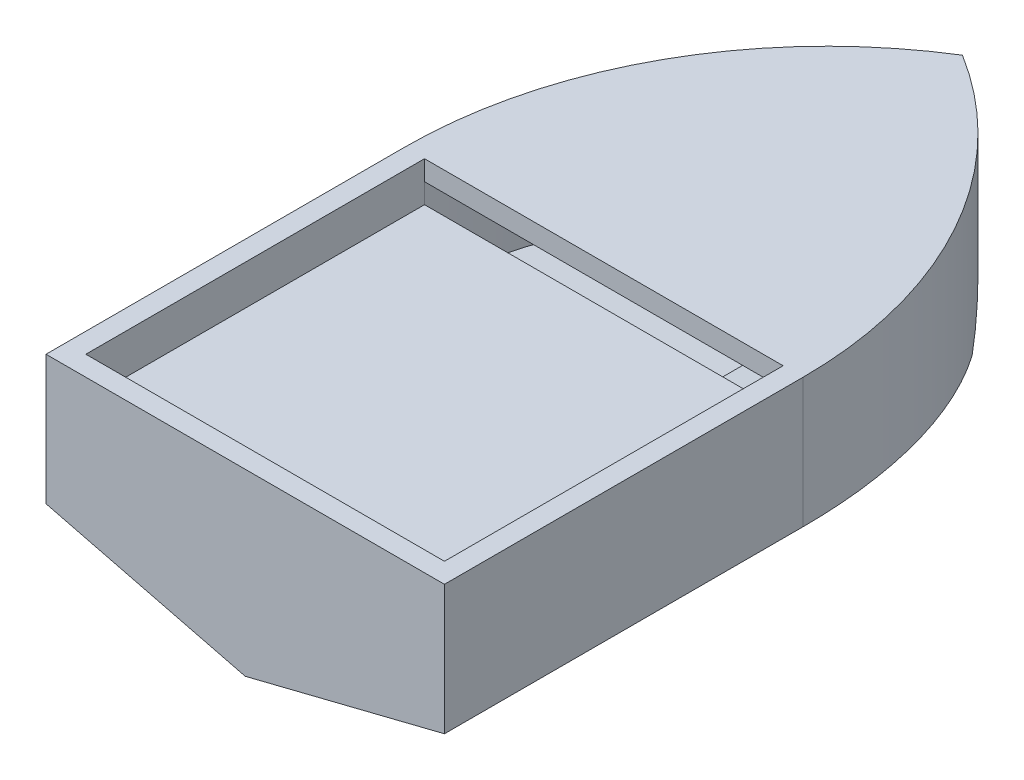
ISO-10303-21;
HEADER;
FILE_DESCRIPTION(('STEP AP214'),'2;1');
FILE_NAME('part.step','',(''),(''),'','','');
FILE_SCHEMA(('AUTOMOTIVE_DESIGN { 1 0 10303 214 1 1 1 1 }'));
ENDSEC;
DATA;
#1=APPLICATION_CONTEXT('core data for automotive mechanical design processes');
#2=APPLICATION_PROTOCOL_DEFINITION('international standard','automotive_design',2000,#1);
#3=PRODUCT_CONTEXT('',#1,'mechanical');
#4=PRODUCT('Part','Part','',(#3));
#5=PRODUCT_RELATED_PRODUCT_CATEGORY('part','',(#4));
#6=PRODUCT_DEFINITION_FORMATION('','',#4);
#7=PRODUCT_DEFINITION_CONTEXT('part definition',#1,'design');
#8=PRODUCT_DEFINITION('design','',#6,#7);
#9=PRODUCT_DEFINITION_SHAPE('','',#8);
#10=(LENGTH_UNIT() NAMED_UNIT(*) SI_UNIT(.MILLI.,.METRE.));
#11=(NAMED_UNIT(*) PLANE_ANGLE_UNIT() SI_UNIT($,.RADIAN.));
#12=(NAMED_UNIT(*) SI_UNIT($,.STERADIAN.) SOLID_ANGLE_UNIT());
#13=UNCERTAINTY_MEASURE_WITH_UNIT(LENGTH_MEASURE(1.E-05),#10,'distance_accuracy_value','');
#14=(GEOMETRIC_REPRESENTATION_CONTEXT(3) GLOBAL_UNCERTAINTY_ASSIGNED_CONTEXT((#13)) GLOBAL_UNIT_ASSIGNED_CONTEXT((#10,
#11,#12)) REPRESENTATION_CONTEXT('',''));
#15=CARTESIAN_POINT('',(0.,0.,0.));
#16=DIRECTION('',(0.,0.,1.));
#17=DIRECTION('',(1.,0.,0.));
#18=AXIS2_PLACEMENT_3D('',#15,#16,#17);
#19=CARTESIAN_POINT('',(-112.,0.,-180.));
#20=DIRECTION('',(0.,1.,0.));
#21=DIRECTION('',(0.,0.,1.));
#22=AXIS2_PLACEMENT_3D('',#19,#20,#21);
#23=CYLINDRICAL_SURFACE('',#22,202.);
#24=DIRECTION('',(0.,1.,0.));
#25=VECTOR('',#24,1.);
#26=CARTESIAN_POINT('',(89.9999999999999,70.,-180.));
#27=LINE('',#26,#25);
#28=CARTESIAN_POINT('',(89.9999999999999,70.,-180.));
#29=VERTEX_POINT('',#28);
#30=CARTESIAN_POINT('',(89.9999999999999,80.,-180.));
#31=VERTEX_POINT('',#30);
#32=EDGE_CURVE('E249',#29,#31,#27,.T.);
#33=ORIENTED_EDGE('',*,*,#32,.T.);
#34=CARTESIAN_POINT('',(-111.999999999996,80.,-180.000000000002));
#35=DIRECTION('',(0.,1.,0.));
#36=DIRECTION('',(0.,0.,1.));
#37=AXIS2_PLACEMENT_3D('',#34,#35,#36);
#38=CIRCLE('',#37,201.999999999995);
#39=CARTESIAN_POINT('',(0.,80.,-348.107108713463));
#40=VERTEX_POINT('',#39);
#41=EDGE_CURVE('E217',#31,#40,#38,.T.);
#42=ORIENTED_EDGE('',*,*,#41,.T.);
#43=DIRECTION('',(0.,1.,0.));
#44=VECTOR('',#43,1.);
#45=CARTESIAN_POINT('',(0.,68.5956105944763,-348.107108713463));
#46=LINE('',#45,#44);
#47=CARTESIAN_POINT('',(0.,68.5956105944763,-348.107108713463));
#48=VERTEX_POINT('',#47);
#49=EDGE_CURVE('E233',#48,#40,#46,.T.);
#50=ORIENTED_EDGE('',*,*,#49,.F.);
#51=CARTESIAN_POINT('',(49.3361791991133,22.6418088638224,-301.550965777453));
#52=CARTESIAN_POINT('',(48.6716609783107,23.1020900188632,-302.432990168302));
#53=CARTESIAN_POINT('',(48.0025410911174,23.5727237002316,-303.306070454104));
#54=CARTESIAN_POINT('',(46.6556948979827,24.5341302377151,-305.034277931563));
#55=CARTESIAN_POINT('',(45.9779688280852,25.0249025423037,-305.889405613912));
#56=CARTESIAN_POINT('',(43.9330336734646,26.5263882226418,-308.427446925237));
#57=CARTESIAN_POINT('',(42.5537630393452,27.5664814912211,-310.083422455992));
#58=CARTESIAN_POINT('',(39.7688347714502,29.7202309508289,-313.322093945463));
#59=CARTESIAN_POINT('',(38.3631881226724,30.8338569834379,-314.90481949914));
#60=CARTESIAN_POINT('',(35.5297575012036,33.1316353268143,-317.997714288231));
#61=CARTESIAN_POINT('',(34.1019726627394,34.3157904009806,-319.50788067651));
#62=CARTESIAN_POINT('',(31.2567714503361,36.7284444225422,-322.427428833234));
#63=CARTESIAN_POINT('',(29.8396784181281,37.9556633779294,-323.838185160537));
#64=CARTESIAN_POINT('',(26.9938638640755,40.4731607495955,-326.589984150274));
#65=CARTESIAN_POINT('',(25.5651422444035,41.7634396968342,-327.931026225523));
#66=CARTESIAN_POINT('',(22.7014086019378,44.4054998565403,-330.543303140245));
#67=CARTESIAN_POINT('',(21.2663976171599,45.7572712417201,-331.81454906288));
#68=CARTESIAN_POINT('',(18.395468368891,48.5218136659109,-334.287428103054));
#69=CARTESIAN_POINT('',(16.9595501971426,49.9345792848463,-335.489067383855));
#70=CARTESIAN_POINT('',(14.2134980494796,52.6999185611655,-337.724501285626));
#71=CARTESIAN_POINT('',(12.9029499087416,54.0475494043758,-338.763910211594));
#72=CARTESIAN_POINT('',(10.2918414545211,56.7947150662428,-340.783793775828));
#73=CARTESIAN_POINT('',(8.99127809536442,58.19423323121,-341.764287063283));
#74=CARTESIAN_POINT('',(7.04663272033688,60.340141592733,-343.194837575301));
#75=CARTESIAN_POINT('',(6.39659801296977,61.0665244000968,-343.666981534174));
#76=CARTESIAN_POINT('',(5.10147817300283,62.5332700525164,-344.596108247045));
#77=CARTESIAN_POINT('',(4.45639298080558,63.2736327288669,-345.053091183819));
#78=CARTESIAN_POINT('',(3.17188533424804,64.7689709547319,-345.951955129347));
#79=CARTESIAN_POINT('',(2.53246540174431,65.5239525780049,-346.393829640546));
#80=CARTESIAN_POINT('',(1.26066616609097,67.0486431556308,-347.262114725204));
#81=CARTESIAN_POINT('',(0.628287099678042,67.8183526028293,-347.688524779779));
#82=CARTESIAN_POINT('',(0.,68.5956105944763,-348.107108713463));
#83=B_SPLINE_CURVE_WITH_KNOTS('',3,(#51,#52,#53,#54,#55,#56,#57,#58,#59,#60,#61,#62,#63,#64,#65,
#66,#67,#68,#69,#70,#71,#72,#73,#74,#75,#76,#77,#78,#79,#80,#81,#82),.UNSPECIFIED.,.F.,.F.,(4,2,
2,2,2,2,2,2,2,2,2,2,2,2,2,4),(0.,3.58905706037471,7.17801589454018,14.3542912611833,
21.5276414455374,28.7012728741112,35.7378052770028,42.7743969371119,49.8098679825338,
56.8447151228703,63.2874269835379,69.7280886029098,72.9772071277983,76.2262864682588,
79.4767459740247,82.727314442696),.UNSPECIFIED.);
#84=CARTESIAN_POINT('',(49.3361791991133,22.6418088638224,-301.550965777453));
#85=VERTEX_POINT('',#84);
#86=EDGE_CURVE('E275',#85,#48,#83,.T.);
#87=ORIENTED_EDGE('',*,*,#86,.F.);
#88=CARTESIAN_POINT('',(-112.,-17.6922359359558,-180.));
#89=DIRECTION('',(0.242535625036332,-0.970142500145332,0.));
#90=DIRECTION('',(0.970142500145332,0.242535625036332,0.));
#91=AXIS2_PLACEMENT_3D('',#88,#89,#90);
#92=ELLIPSE('',#91,208.216834093692,202.);
#93=CARTESIAN_POINT('',(90.,32.8077640640441,-180.));
#94=VERTEX_POINT('',#93);
#95=EDGE_CURVE('E401',#94,#85,#92,.F.);
#96=ORIENTED_EDGE('',*,*,#95,.F.);
#97=DIRECTION('',(0.,1.,0.));
#98=VECTOR('',#97,1.);
#99=CARTESIAN_POINT('',(90.,121.428571428571,-180.));
#100=LINE('',#99,#98);
#101=CARTESIAN_POINT('',(90.,49.9999999999999,-180.));
#102=VERTEX_POINT('',#101);
#103=EDGE_CURVE('E407',#94,#102,#100,.T.);
#104=ORIENTED_EDGE('',*,*,#103,.T.);
#105=DIRECTION('',(0.,1.,0.));
#106=VECTOR('',#105,1.);
#107=CARTESIAN_POINT('',(89.9999999999999,50.,-180.));
#108=LINE('',#107,#106);
#109=EDGE_CURVE('E256',#102,#29,#108,.T.);
#110=ORIENTED_EDGE('',*,*,#109,.T.);
#111=EDGE_LOOP('',(#33,#42,#50,#87,#96,#104,#110));
#112=FACE_BOUND('',#111,.T.);
#113=ADVANCED_FACE('F73',(#112),#23,.F.);
#114=CARTESIAN_POINT('',(112.,0.,-180.));
#115=DIRECTION('',(0.,1.,0.));
#116=DIRECTION('',(0.,0.,1.));
#117=AXIS2_PLACEMENT_3D('',#114,#115,#116);
#118=CYLINDRICAL_SURFACE('',#117,202.);
#119=CARTESIAN_POINT('',(112.,80.,-180.));
#120=DIRECTION('',(0.,1.,0.));
#121=DIRECTION('',(0.,0.,1.));
#122=AXIS2_PLACEMENT_3D('',#119,#120,#121);
#123=CIRCLE('',#122,202.);
#124=CARTESIAN_POINT('',(-89.9999999999999,80.,-180.));
#125=VERTEX_POINT('',#124);
#126=EDGE_CURVE('E222',#40,#125,#123,.T.);
#127=ORIENTED_EDGE('',*,*,#126,.T.);
#128=DIRECTION('',(0.,1.,0.));
#129=VECTOR('',#128,1.);
#130=CARTESIAN_POINT('',(-89.9999999999999,70.,-180.));
#131=LINE('',#130,#129);
#132=CARTESIAN_POINT('',(-89.9999999999999,70.,-180.));
#133=VERTEX_POINT('',#132);
#134=EDGE_CURVE('E230',#133,#125,#131,.T.);
#135=ORIENTED_EDGE('',*,*,#134,.F.);
#136=DIRECTION('',(0.,1.,0.));
#137=VECTOR('',#136,1.);
#138=CARTESIAN_POINT('',(-89.9999999999999,50.,-180.));
#139=LINE('',#138,#137);
#140=CARTESIAN_POINT('',(-89.9999999999999,49.9999999999999,-180.));
#141=VERTEX_POINT('',#140);
#142=EDGE_CURVE('E255',#141,#133,#139,.T.);
#143=ORIENTED_EDGE('',*,*,#142,.F.);
#144=DIRECTION('',(0.,1.,0.));
#145=VECTOR('',#144,1.);
#146=CARTESIAN_POINT('',(-89.9999999999999,0.,-180.));
#147=LINE('',#146,#145);
#148=CARTESIAN_POINT('',(-89.9999999999999,32.807764064044,-180.));
#149=VERTEX_POINT('',#148);
#150=EDGE_CURVE('E259',#149,#141,#147,.T.);
#151=ORIENTED_EDGE('',*,*,#150,.F.);
#152=CARTESIAN_POINT('',(112.,-17.6922359359557,-180.));
#153=DIRECTION('',(-0.242535625036332,-0.970142500145332,0.));
#154=DIRECTION('',(-0.970142500145332,0.242535625036332,0.));
#155=AXIS2_PLACEMENT_3D('',#152,#153,#154);
#156=ELLIPSE('',#155,208.216834093692,202.);
#157=CARTESIAN_POINT('',(-49.3361791991134,22.6418088638224,-301.550965777453));
#158=VERTEX_POINT('',#157);
#159=EDGE_CURVE('E274',#149,#158,#156,.T.);
#160=ORIENTED_EDGE('',*,*,#159,.T.);
#161=CARTESIAN_POINT('',(-49.3361791991134,22.6418088638224,-301.550965777453));
#162=CARTESIAN_POINT('',(-48.6716609783108,23.1020900188631,-302.432990168302));
#163=CARTESIAN_POINT('',(-48.0025410911174,23.5727237002316,-303.306070454104));
#164=CARTESIAN_POINT('',(-46.6556948979828,24.5341302377151,-305.034277931563));
#165=CARTESIAN_POINT('',(-45.9779688280853,25.0249025423037,-305.889405613912));
#166=CARTESIAN_POINT('',(-43.9330336734647,26.5263882226418,-308.427446925237));
#167=CARTESIAN_POINT('',(-42.5537630393452,27.5664814912212,-310.083422455992));
#168=CARTESIAN_POINT('',(-39.7688347714502,29.7202309508289,-313.322093945463));
#169=CARTESIAN_POINT('',(-38.3631881226724,30.833856983438,-314.90481949914));
#170=CARTESIAN_POINT('',(-35.5297575012037,33.1316353268143,-317.997714288231));
#171=CARTESIAN_POINT('',(-34.1019726627394,34.3157904009806,-319.50788067651));
#172=CARTESIAN_POINT('',(-31.2567714503362,36.7284444225422,-322.427428833234));
#173=CARTESIAN_POINT('',(-29.8396784181282,37.9556633779294,-323.838185160537));
#174=CARTESIAN_POINT('',(-26.9938638640756,40.4731607495955,-326.589984150274));
#175=CARTESIAN_POINT('',(-25.5651422444036,41.7634396968341,-327.931026225523));
#176=CARTESIAN_POINT('',(-22.7014086019379,44.4054998565403,-330.543303140245));
#177=CARTESIAN_POINT('',(-21.26639761716,45.7572712417201,-331.81454906288));
#178=CARTESIAN_POINT('',(-18.3954683688911,48.5218136659109,-334.287428103054));
#179=CARTESIAN_POINT('',(-16.9595501971427,49.9345792848462,-335.489067383855));
#180=CARTESIAN_POINT('',(-14.2134980494796,52.6999185611655,-337.724501285626));
#181=CARTESIAN_POINT('',(-12.9029499087417,54.0475494043758,-338.763910211594));
#182=CARTESIAN_POINT('',(-10.2918414545212,56.7947150662428,-340.783793775828));
#183=CARTESIAN_POINT('',(-8.99127809536447,58.19423323121,-341.764287063283));
#184=CARTESIAN_POINT('',(-7.04663272033697,60.3401415927329,-343.194837575301));
#185=CARTESIAN_POINT('',(-6.39659801296989,61.0665244000968,-343.666981534174));
#186=CARTESIAN_POINT('',(-5.10147817300295,62.5332700525164,-344.596108247045));
#187=CARTESIAN_POINT('',(-4.45639298080568,63.2736327288669,-345.053091183819));
#188=CARTESIAN_POINT('',(-3.17188533424813,64.7689709547318,-345.951955129347));
#189=CARTESIAN_POINT('',(-2.53246540174442,65.5239525780049,-346.393829640546));
#190=CARTESIAN_POINT('',(-1.2606661660911,67.0486431556308,-347.262114725204));
#191=CARTESIAN_POINT('',(-0.628287099678181,67.8183526028293,-347.688524779779));
#192=CARTESIAN_POINT('',(0.,68.5956105944763,-348.107108713463));
#193=B_SPLINE_CURVE_WITH_KNOTS('',3,(#161,#162,#163,#164,#165,#166,#167,#168,#169,#170,#171,
#172,#173,#174,#175,#176,#177,#178,#179,#180,#181,#182,#183,#184,#185,#186,#187,#188,#189,#190,
#191,#192),.UNSPECIFIED.,.F.,.F.,(4,2,2,2,2,2,2,2,2,2,2,2,2,2,2,4),(0.,3.58905706037471,
7.17801589454018,14.3542912611833,21.5276414455375,28.7012728741112,35.7378052770027,
42.7743969371118,49.8098679825338,56.8447151228703,63.2874269835379,69.7280886029098,
72.9772071277983,76.2262864682588,79.4767459740247,82.7273144426959),.UNSPECIFIED.);
#194=EDGE_CURVE('E266',#158,#48,#193,.T.);
#195=ORIENTED_EDGE('',*,*,#194,.T.);
#196=ORIENTED_EDGE('',*,*,#49,.T.);
#197=EDGE_LOOP('',(#127,#135,#143,#151,#160,#195,#196));
#198=FACE_BOUND('',#197,.T.);
#199=ADVANCED_FACE('F229',(#198),#118,.F.);
#200=CARTESIAN_POINT('',(89.9999999999999,50.,-180.));
#201=DIRECTION('',(0.,0.,-1.));
#202=DIRECTION('',(-1.,0.,0.));
#203=AXIS2_PLACEMENT_3D('',#200,#201,#202);
#204=PLANE('',#203);
#205=ORIENTED_EDGE('',*,*,#142,.T.);
#206=DIRECTION('',(-1.,0.,0.));
#207=VECTOR('',#206,1.);
#208=CARTESIAN_POINT('',(89.9999999999999,70.,-180.));
#209=LINE('',#208,#207);
#210=EDGE_CURVE('E450',#29,#133,#209,.T.);
#211=ORIENTED_EDGE('',*,*,#210,.F.);
#212=ORIENTED_EDGE('',*,*,#109,.F.);
#213=DIRECTION('',(-1.,0.,0.));
#214=VECTOR('',#213,1.);
#215=CARTESIAN_POINT('',(89.9999999999999,50.,-180.));
#216=LINE('',#215,#214);
#217=EDGE_CURVE('E246',#102,#141,#216,.T.);
#218=ORIENTED_EDGE('',*,*,#217,.T.);
#219=EDGE_LOOP('',(#205,#211,#212,#218));
#220=FACE_BOUND('',#219,.T.);
#221=ADVANCED_FACE('F287',(#220),#204,.T.);
#222=CARTESIAN_POINT('',(-90.,121.428571428571,-250.));
#223=DIRECTION('',(1.,0.,0.));
#224=DIRECTION('',(0.,0.,-1.));
#225=AXIS2_PLACEMENT_3D('',#222,#223,#224);
#226=PLANE('',#225);
#227=ORIENTED_EDGE('',*,*,#150,.T.);
#228=DIRECTION('',(0.,0.,1.));
#229=VECTOR('',#228,1.);
#230=CARTESIAN_POINT('',(-89.9999999999999,50.,-180.));
#231=LINE('',#230,#229);
#232=CARTESIAN_POINT('',(-90.,49.9999999999999,-10.));
#233=VERTEX_POINT('',#232);
#234=EDGE_CURVE('E96',#141,#233,#231,.T.);
#235=ORIENTED_EDGE('',*,*,#234,.T.);
#236=DIRECTION('',(0.,-1.,0.));
#237=VECTOR('',#236,1.);
#238=CARTESIAN_POINT('',(-90.,121.428571428571,-10.));
#239=LINE('',#238,#237);
#240=CARTESIAN_POINT('',(-90.,32.8077640640441,-10.));
#241=VERTEX_POINT('',#240);
#242=EDGE_CURVE('E416',#233,#241,#239,.T.);
#243=ORIENTED_EDGE('',*,*,#242,.T.);
#244=DIRECTION('',(0.,0.,-1.));
#245=VECTOR('',#244,1.);
#246=CARTESIAN_POINT('',(-90.,32.8077640640441,-250.));
#247=LINE('',#246,#245);
#248=EDGE_CURVE('E403',#241,#149,#247,.T.);
#249=ORIENTED_EDGE('',*,*,#248,.T.);
#250=EDGE_LOOP('',(#227,#235,#243,#249));
#251=FACE_BOUND('',#250,.T.);
#252=ADVANCED_FACE('F292',(#251),#226,.T.);
#253=CARTESIAN_POINT('',(-100.,89.9999999999999,-10.));
#254=DIRECTION('',(0.,0.,1.));
#255=DIRECTION('',(0.,-1.,0.));
#256=AXIS2_PLACEMENT_3D('',#253,#254,#255);
#257=PLANE('',#256);
#258=DIRECTION('',(1.,0.,0.));
#259=VECTOR('',#258,1.);
#260=CARTESIAN_POINT('',(-90.,49.9999999999999,-10.));
#261=LINE('',#260,#259);
#262=CARTESIAN_POINT('',(90.,50.,-10.));
#263=VERTEX_POINT('',#262);
#264=EDGE_CURVE('E251',#233,#263,#261,.T.);
#265=ORIENTED_EDGE('',*,*,#264,.T.);
#266=DIRECTION('',(0.,-1.,0.));
#267=VECTOR('',#266,1.);
#268=CARTESIAN_POINT('',(90.,121.428571428571,-10.));
#269=LINE('',#268,#267);
#270=CARTESIAN_POINT('',(90.,32.8077640640441,-10.));
#271=VERTEX_POINT('',#270);
#272=EDGE_CURVE('E264',#263,#271,#269,.T.);
#273=ORIENTED_EDGE('',*,*,#272,.T.);
#274=DIRECTION('',(0.970142500145332,0.242535625036332,0.));
#275=VECTOR('',#274,1.);
#276=CARTESIAN_POINT('',(-75.3665327209517,-8.53386911619371,-10.));
#277=LINE('',#276,#275);
#278=CARTESIAN_POINT('',(0.,10.3077640640441,-10.));
#279=VERTEX_POINT('',#278);
#280=EDGE_CURVE('E413',#279,#271,#277,.T.);
#281=ORIENTED_EDGE('',*,*,#280,.F.);
#282=DIRECTION('',(0.970142500145332,-0.242535625036332,0.));
#283=VECTOR('',#282,1.);
#284=CARTESIAN_POINT('',(-112.868761396695,38.5249544132179,-10.));
#285=LINE('',#284,#283);
#286=EDGE_CURVE('E421',#241,#279,#285,.T.);
#287=ORIENTED_EDGE('',*,*,#286,.F.);
#288=ORIENTED_EDGE('',*,*,#242,.F.);
#289=EDGE_LOOP('',(#265,#273,#281,#287,#288));
#290=FACE_BOUND('',#289,.T.);
#291=ADVANCED_FACE('F295',(#290),#257,.F.);
#292=CARTESIAN_POINT('',(90.,121.428571428571,-250.));
#293=DIRECTION('',(1.,0.,0.));
#294=DIRECTION('',(0.,0.,-1.));
#295=AXIS2_PLACEMENT_3D('',#292,#293,#294);
#296=PLANE('',#295);
#297=DIRECTION('',(0.,0.,-1.));
#298=VECTOR('',#297,1.);
#299=CARTESIAN_POINT('',(90.,49.9999999999999,-10.));
#300=LINE('',#299,#298);
#301=EDGE_CURVE('E253',#263,#102,#300,.T.);
#302=ORIENTED_EDGE('',*,*,#301,.T.);
#303=ORIENTED_EDGE('',*,*,#103,.F.);
#304=DIRECTION('',(0.,0.,1.));
#305=VECTOR('',#304,1.);
#306=CARTESIAN_POINT('',(90.,32.8077640640441,-360.));
#307=LINE('',#306,#305);
#308=EDGE_CURVE('E410',#94,#271,#307,.T.);
#309=ORIENTED_EDGE('',*,*,#308,.T.);
#310=ORIENTED_EDGE('',*,*,#272,.F.);
#311=EDGE_LOOP('',(#302,#303,#309,#310));
#312=FACE_BOUND('',#311,.T.);
#313=ADVANCED_FACE('F307',(#312),#296,.F.);
#314=CARTESIAN_POINT('',(-100.,90.,-360.));
#315=DIRECTION('',(0.,1.,0.));
#316=DIRECTION('',(0.,0.,1.));
#317=AXIS2_PLACEMENT_3D('',#314,#315,#316);
#318=PLANE('',#317);
#319=DIRECTION('',(1.,0.,0.));
#320=VECTOR('',#319,1.);
#321=CARTESIAN_POINT('',(-89.9999999999999,90.,-180.));
#322=LINE('',#321,#320);
#323=CARTESIAN_POINT('',(-89.9999999999999,90.,-180.));
#324=VERTEX_POINT('',#323);
#325=CARTESIAN_POINT('',(89.9999999999999,90.,-180.));
#326=VERTEX_POINT('',#325);
#327=EDGE_CURVE('E211',#324,#326,#322,.T.);
#328=ORIENTED_EDGE('',*,*,#327,.T.);
#329=DIRECTION('',(0.,0.,-1.));
#330=VECTOR('',#329,1.);
#331=CARTESIAN_POINT('',(90.,89.9999999999999,-10.));
#332=LINE('',#331,#330);
#333=CARTESIAN_POINT('',(90.,89.9999999999999,-10.));
#334=VERTEX_POINT('',#333);
#335=EDGE_CURVE('E452',#334,#326,#332,.T.);
#336=ORIENTED_EDGE('',*,*,#335,.F.);
#337=DIRECTION('',(1.,0.,0.));
#338=VECTOR('',#337,1.);
#339=CARTESIAN_POINT('',(-90.,89.9999999999999,-10.));
#340=LINE('',#339,#338);
#341=CARTESIAN_POINT('',(-90.,89.9999999999999,-10.));
#342=VERTEX_POINT('',#341);
#343=EDGE_CURVE('E456',#342,#334,#340,.T.);
#344=ORIENTED_EDGE('',*,*,#343,.F.);
#345=DIRECTION('',(0.,0.,1.));
#346=VECTOR('',#345,1.);
#347=CARTESIAN_POINT('',(-89.9999999999999,90.,-180.));
#348=LINE('',#347,#346);
#349=EDGE_CURVE('E448',#324,#342,#348,.T.);
#350=ORIENTED_EDGE('',*,*,#349,.F.);
#351=EDGE_LOOP('',(#328,#336,#344,#350));
#352=FACE_BOUND('',#351,.T.);
#353=CARTESIAN_POINT('',(-112.,90.,-180.));
#354=DIRECTION('',(0.,1.,0.));
#355=DIRECTION('',(0.,0.,1.));
#356=AXIS2_PLACEMENT_3D('',#353,#354,#355);
#357=CIRCLE('',#356,212.);
#358=CARTESIAN_POINT('',(0.,90.,-360.));
#359=VERTEX_POINT('',#358);
#360=CARTESIAN_POINT('',(100.,90.,-180.));
#361=VERTEX_POINT('',#360);
#362=EDGE_CURVE('E330',#359,#361,#357,.F.);
#363=ORIENTED_EDGE('',*,*,#362,.F.);
#364=CARTESIAN_POINT('',(112.,90.,-180.));
#365=DIRECTION('',(0.,1.,0.));
#366=DIRECTION('',(0.,0.,1.));
#367=AXIS2_PLACEMENT_3D('',#364,#365,#366);
#368=CIRCLE('',#367,212.);
#369=CARTESIAN_POINT('',(-100.,90.,-180.));
#370=VERTEX_POINT('',#369);
#371=EDGE_CURVE('E399',#359,#370,#368,.T.);
#372=ORIENTED_EDGE('',*,*,#371,.T.);
#373=DIRECTION('',(0.,0.,1.));
#374=VECTOR('',#373,1.);
#375=CARTESIAN_POINT('',(-100.,90.,-360.));
#376=LINE('',#375,#374);
#377=CARTESIAN_POINT('',(-100.,89.9999999999999,0.));
#378=VERTEX_POINT('',#377);
#379=EDGE_CURVE('E373',#370,#378,#376,.T.);
#380=ORIENTED_EDGE('',*,*,#379,.T.);
#381=DIRECTION('',(1.,0.,0.));
#382=VECTOR('',#381,1.);
#383=CARTESIAN_POINT('',(-100.,89.9999999999999,0.));
#384=LINE('',#383,#382);
#385=CARTESIAN_POINT('',(100.,89.9999999999999,0.));
#386=VERTEX_POINT('',#385);
#387=EDGE_CURVE('E376',#378,#386,#384,.T.);
#388=ORIENTED_EDGE('',*,*,#387,.T.);
#389=DIRECTION('',(0.,0.,1.));
#390=VECTOR('',#389,1.);
#391=CARTESIAN_POINT('',(100.,90.,-360.));
#392=LINE('',#391,#390);
#393=EDGE_CURVE('E374',#361,#386,#392,.T.);
#394=ORIENTED_EDGE('',*,*,#393,.F.);
#395=EDGE_LOOP('',(#363,#372,#380,#388,#394));
#396=FACE_BOUND('',#395,.T.);
#397=ADVANCED_FACE('F311',(#352,#396),#318,.T.);
#398=CARTESIAN_POINT('',(-100.,121.428571428571,-250.));
#399=DIRECTION('',(1.,0.,0.));
#400=DIRECTION('',(0.,0.,-1.));
#401=AXIS2_PLACEMENT_3D('',#398,#399,#400);
#402=CYLINDRICAL_SURFACE('',#401,121.428571428571);
#403=CARTESIAN_POINT('',(-485.714285714287,121.428571428571,-250.));
#404=DIRECTION('',(-0.242535625036332,-0.970142500145332,0.));
#405=DIRECTION('',(0.970142500145332,-0.242535625036332,0.));
#406=AXIS2_PLACEMENT_3D('',#403,#404,#405);
#407=ELLIPSE('',#406,500.66282596786,121.428571428571);
#408=CARTESIAN_POINT('',(0.,0.,-250.));
#409=VERTEX_POINT('',#408);
#410=CARTESIAN_POINT('',(-57.5129405753566,14.3782351438391,-307.315996549907));
#411=VERTEX_POINT('',#410);
#412=EDGE_CURVE('E366',#409,#411,#407,.F.);
#413=ORIENTED_EDGE('',*,*,#412,.T.);
#414=CARTESIAN_POINT('',(-88.3969309273331,0.00280803757254922,-249.174200934349));
#415=CARTESIAN_POINT('',(-88.0930334322624,-0.0031800796248773,-250.054594837966));
#416=CARTESIAN_POINT('',(-87.7833232957192,0.000422494013983467,-250.933004094104));
#417=CARTESIAN_POINT('',(-87.1524543352077,0.026534831367768,-252.685397672566));
#418=CARTESIAN_POINT('',(-86.8312957729075,0.0490441632101814,-253.559382095503));
#419=CARTESIAN_POINT('',(-85.8510285142674,0.144507901566427,-256.17370841758));
#420=CARTESIAN_POINT('',(-85.1750003224168,0.245395765226502,-257.906793916337));
#421=CARTESIAN_POINT('',(-83.7805624261587,0.519069506453189,-261.347486115836));
#422=CARTESIAN_POINT('',(-83.062205486258,0.691767431670554,-263.055121346695));
#423=CARTESIAN_POINT('',(-81.5842352712115,1.10647167444525,-266.443976251335));
#424=CARTESIAN_POINT('',(-80.8246205740886,1.34848038207653,-268.125195012077));
#425=CARTESIAN_POINT('',(-79.2732178579376,1.89663260070155,-271.443317764269));
#426=CARTESIAN_POINT('',(-78.4817796295753,2.20218123562037,-273.080484010519));
#427=CARTESIAN_POINT('',(-76.8625023056707,2.87601796907752,-276.323623027943));
#428=CARTESIAN_POINT('',(-76.0346623438004,3.24430756139336,-277.929595055412));
#429=CARTESIAN_POINT('',(-74.3445180209973,4.04102971491373,-281.108665863568));
#430=CARTESIAN_POINT('',(-73.4822047018543,4.46947798251159,-282.681755935726));
#431=CARTESIAN_POINT('',(-71.7254782799926,5.38377692267189,-285.792911175596));
#432=CARTESIAN_POINT('',(-70.8310651054586,5.86962772366341,-287.330976264937));
#433=CARTESIAN_POINT('',(-69.0170064716649,6.89347175940283,-290.362801535142));
#434=CARTESIAN_POINT('',(-68.0975153184482,7.4311825169778,-291.856749619128));
#435=CARTESIAN_POINT('',(-66.2309542289674,8.55840032200007,-294.807557036874));
#436=CARTESIAN_POINT('',(-65.2838821083432,9.14791147943957,-296.264413415823));
#437=CARTESIAN_POINT('',(-63.3644727757354,10.3762282434765,-299.139787476538));
#438=CARTESIAN_POINT('',(-62.3921399883358,11.0150252554085,-300.55831178481));
#439=CARTESIAN_POINT('',(-60.4240875592275,12.3397841874455,-303.356641241445));
#440=CARTESIAN_POINT('',(-59.4283661881191,13.0257496025528,-304.736443509959));
#441=CARTESIAN_POINT('',(-56.4032967810719,15.1553527504241,-308.824856359862));
#442=CARTESIAN_POINT('',(-54.3414646205764,16.6672192265728,-311.474378190814));
#443=CARTESIAN_POINT('',(-50.1478318908853,19.8570755911978,-316.612887597243));
#444=CARTESIAN_POINT('',(-48.0160268919036,21.5350760107647,-319.101864979407));
#445=CARTESIAN_POINT('',(-44.5584386324196,24.3455560988561,-322.958883980358));
#446=CARTESIAN_POINT('',(-43.2498735586568,25.4290598070137,-324.37847688322));
#447=CARTESIAN_POINT('',(-40.6163465347733,27.6497013854052,-327.159497530673));
#448=CARTESIAN_POINT('',(-39.2913840955939,28.7868408582067,-328.520923534992));
#449=CARTESIAN_POINT('',(-36.6283209791898,31.11312818409,-331.185884042789));
#450=CARTESIAN_POINT('',(-35.2902178343235,32.3022859561302,-332.489407408923));
#451=CARTESIAN_POINT('',(-32.6046533506278,34.7310580765304,-335.038451777734));
#452=CARTESIAN_POINT('',(-31.2571921354741,35.970671759117,-336.283973545287));
#453=CARTESIAN_POINT('',(-28.5585505213707,38.4976335658191,-338.715429989374));
#454=CARTESIAN_POINT('',(-27.2073783213264,39.7849100501691,-339.901448250563));
#455=CARTESIAN_POINT('',(-24.5032852958332,42.4084893255496,-342.215968179823));
#456=CARTESIAN_POINT('',(-23.1503644288808,43.7447933016251,-343.344468456048));
#457=CARTESIAN_POINT('',(-20.4475334690684,46.4660674519395,-345.543605272583));
#458=CARTESIAN_POINT('',(-19.0976225888149,47.8510227725525,-346.614259224759));
#459=CARTESIAN_POINT('',(-16.4053216396644,50.6705208055784,-348.697866915739));
#460=CARTESIAN_POINT('',(-15.0629309775074,52.1050595405366,-349.710825265555));
#461=CARTESIAN_POINT('',(-12.5493788661881,54.8521166442016,-351.562209296235));
#462=CARTESIAN_POINT('',(-11.3767704434426,56.1589599149167,-352.407095781475));
#463=CARTESIAN_POINT('',(-9.04626151348392,58.8132908499391,-354.051244353662));
#464=CARTESIAN_POINT('',(-7.88835815619295,60.1607704619973,-354.85051538987));
#465=CARTESIAN_POINT('',(-5.59329081412602,62.897022302035,-356.402194785031));
#466=CARTESIAN_POINT('',(-4.45610705820857,64.2857514366263,-357.154649673606));
#467=CARTESIAN_POINT('',(-2.76948326008648,66.4025829138079,-358.248184185625));
#468=CARTESIAN_POINT('',(-2.21037471029851,67.1139390693606,-358.606895195709));
#469=CARTESIAN_POINT('',(-1.09947426689138,68.548212707032,-359.312414926005));
#470=CARTESIAN_POINT('',(-0.547682608969851,69.2711305599386,-359.659223263367));
#471=CARTESIAN_POINT('',(-1.65667431126058E-13,69.9999999999999,-360.));
#472=B_SPLINE_CURVE_WITH_KNOTS('',3,(#414,#415,#416,#417,#418,#419,#420,#421,#422,#423,#424,
#425,#426,#427,#428,#429,#430,#431,#432,#433,#434,#435,#436,#437,#438,#439,#440,#441,#442,#443,
#444,#445,#446,#447,#448,#449,#450,#451,#452,#453,#454,#455,#456,#457,#458,#459,#460,#461,#462,
#463,#464,#465,#466,#467,#468,#469,#470,#471),.UNSPECIFIED.,.F.,.F.,(4,2,2,2,2,2,2,2,2,2,2,2,2,
2,2,2,2,2,2,2,2,2,2,2,2,2,2,2,4),(0.,2.79401454416201,5.58796526853807,11.1746919139418,
16.7545960458525,22.3346926152038,27.8647263756089,33.394891817058,38.926503783412,
44.4581281261053,49.9611622411886,55.4646333777079,60.9671469565967,66.4700686914366,
77.506877161026,88.544385693069,95.184900791846,101.825614426514,108.467599893699,
115.109497747277,121.741788331824,128.374239331403,135.004682697996,141.634595416175,
147.479156790087,153.322567554154,159.160074710017,162.079812347494,164.999643810552),.UNSPECIFIED.);
#473=CARTESIAN_POINT('',(0.,69.9999999999999,-360.));
#474=VERTEX_POINT('',#473);
#475=EDGE_CURVE('E322',#411,#474,#472,.T.);
#476=ORIENTED_EDGE('',*,*,#475,.T.);
#477=CARTESIAN_POINT('',(88.3969309273331,0.00280803757254922,-249.174200934349));
#478=CARTESIAN_POINT('',(88.0930334322624,-0.00318007962487112,-250.054594837966));
#479=CARTESIAN_POINT('',(87.7833232957192,0.000422494013992735,-250.933004094104));
#480=CARTESIAN_POINT('',(87.1524543352077,0.0265348313677798,-252.685397672566));
#481=CARTESIAN_POINT('',(86.8312957729075,0.0490441632101929,-253.559382095503));
#482=CARTESIAN_POINT('',(85.8510285142674,0.144507901566435,-256.17370841758));
#483=CARTESIAN_POINT('',(85.1750003224168,0.245395765226501,-257.906793916337));
#484=CARTESIAN_POINT('',(83.7805624261587,0.519069506453183,-261.347486115836));
#485=CARTESIAN_POINT('',(83.062205486258,0.691767431670552,-263.055121346695));
#486=CARTESIAN_POINT('',(81.5842352712115,1.10647167444525,-266.443976251335));
#487=CARTESIAN_POINT('',(80.8246205740886,1.34848038207653,-268.125195012077));
#488=CARTESIAN_POINT('',(79.2732178579376,1.89663260070154,-271.443317764269));
#489=CARTESIAN_POINT('',(78.4817796295753,2.20218123562037,-273.080484010519));
#490=CARTESIAN_POINT('',(76.8625023056706,2.87601796907754,-276.323623027943));
#491=CARTESIAN_POINT('',(76.0346623438004,3.24430756139338,-277.929595055412));
#492=CARTESIAN_POINT('',(74.3445180209973,4.04102971491374,-281.108665863568));
#493=CARTESIAN_POINT('',(73.4822047018543,4.46947798251159,-282.681755935726));
#494=CARTESIAN_POINT('',(71.7254782799926,5.38377692267188,-285.792911175596));
#495=CARTESIAN_POINT('',(70.8310651054586,5.8696277236634,-287.330976264937));
#496=CARTESIAN_POINT('',(69.0170064716649,6.89347175940282,-290.362801535142));
#497=CARTESIAN_POINT('',(68.0975153184483,7.43118251697778,-291.856749619128));
#498=CARTESIAN_POINT('',(66.2309542289674,8.55840032200005,-294.807557036874));
#499=CARTESIAN_POINT('',(65.2838821083432,9.14791147943955,-296.264413415823));
#500=CARTESIAN_POINT('',(63.3644727757355,10.3762282434764,-299.139787476538));
#501=CARTESIAN_POINT('',(62.3921399883358,11.0150252554085,-300.55831178481));
#502=CARTESIAN_POINT('',(60.4240875592276,12.3397841874454,-303.356641241445));
#503=CARTESIAN_POINT('',(59.4283661881192,13.0257496025527,-304.736443509959));
#504=CARTESIAN_POINT('',(56.403296781072,15.1553527504241,-308.824856359862));
#505=CARTESIAN_POINT('',(54.3414646205764,16.6672192265727,-311.474378190814));
#506=CARTESIAN_POINT('',(50.1478318908853,19.8570755911978,-316.612887597243));
#507=CARTESIAN_POINT('',(48.0160268919036,21.5350760107647,-319.101864979407));
#508=CARTESIAN_POINT('',(44.5584386324196,24.345556098856,-322.958883980358));
#509=CARTESIAN_POINT('',(43.2498735586569,25.4290598070136,-324.37847688322));
#510=CARTESIAN_POINT('',(40.6163465347733,27.6497013854051,-327.159497530673));
#511=CARTESIAN_POINT('',(39.2913840955939,28.7868408582066,-328.520923534992));
#512=CARTESIAN_POINT('',(36.6283209791898,31.11312818409,-331.185884042789));
#513=CARTESIAN_POINT('',(35.2902178343235,32.3022859561302,-332.489407408923));
#514=CARTESIAN_POINT('',(32.6046533506278,34.7310580765304,-335.038451777734));
#515=CARTESIAN_POINT('',(31.2571921354741,35.970671759117,-336.283973545287));
#516=CARTESIAN_POINT('',(28.5585505213706,38.497633565819,-338.715429989374));
#517=CARTESIAN_POINT('',(27.2073783213264,39.784910050169,-339.901448250563));
#518=CARTESIAN_POINT('',(24.5032852958332,42.4084893255495,-342.215968179823));
#519=CARTESIAN_POINT('',(23.1503644288808,43.744793301625,-343.344468456048));
#520=CARTESIAN_POINT('',(20.4475334690683,46.4660674519394,-345.543605272583));
#521=CARTESIAN_POINT('',(19.0976225888148,47.8510227725525,-346.614259224759));
#522=CARTESIAN_POINT('',(16.4053216396644,50.6705208055784,-348.697866915739));
#523=CARTESIAN_POINT('',(15.0629309775073,52.1050595405366,-349.710825265555));
#524=CARTESIAN_POINT('',(12.5493788661881,54.8521166442015,-351.562209296235));
#525=CARTESIAN_POINT('',(11.3767704434425,56.1589599149166,-352.407095781475));
#526=CARTESIAN_POINT('',(9.04626151348383,58.813290849939,-354.051244353662));
#527=CARTESIAN_POINT('',(7.88835815619286,60.1607704619972,-354.85051538987));
#528=CARTESIAN_POINT('',(5.59329081412592,62.8970223020349,-356.402194785031));
#529=CARTESIAN_POINT('',(4.45610705820846,64.2857514366262,-357.154649673606));
#530=CARTESIAN_POINT('',(2.76948326008639,66.4025829138079,-358.248184185625));
#531=CARTESIAN_POINT('',(2.21037471029842,67.1139390693606,-358.606895195709));
#532=CARTESIAN_POINT('',(1.0994742668913,68.548212707032,-359.312414926005));
#533=CARTESIAN_POINT('',(0.547682608969779,69.2711305599386,-359.659223263367));
#534=CARTESIAN_POINT('',(0.,69.9999999999999,-360.));
#535=B_SPLINE_CURVE_WITH_KNOTS('',3,(#477,#478,#479,#480,#481,#482,#483,#484,#485,#486,#487,
#488,#489,#490,#491,#492,#493,#494,#495,#496,#497,#498,#499,#500,#501,#502,#503,#504,#505,#506,
#507,#508,#509,#510,#511,#512,#513,#514,#515,#516,#517,#518,#519,#520,#521,#522,#523,#524,#525,
#526,#527,#528,#529,#530,#531,#532,#533,#534),.UNSPECIFIED.,.F.,.F.,(4,2,2,2,2,2,2,2,2,2,2,2,2,
2,2,2,2,2,2,2,2,2,2,2,2,2,2,2,4),(0.,2.79401454416203,5.58796526853815,11.1746919139418,
16.7545960458526,22.3346926152038,27.8647263756089,33.3948918170581,38.926503783412,
44.4581281261053,49.9611622411885,55.4646333777078,60.9671469565965,66.4700686914365,
77.5068771610259,88.5443856930689,95.1849007918458,101.825614426514,108.467599893699,
115.109497747277,121.741788331824,128.374239331403,135.004682697996,141.634595416175,
147.479156790087,153.322567554154,159.160074710017,162.079812347494,164.999643810552),.UNSPECIFIED.);
#536=CARTESIAN_POINT('',(57.5129405753551,14.3782351438387,-307.315996549908));
#537=VERTEX_POINT('',#536);
#538=EDGE_CURVE('E343',#537,#474,#535,.T.);
#539=ORIENTED_EDGE('',*,*,#538,.F.);
#540=CARTESIAN_POINT('',(485.714285714287,121.428571428571,-250.));
#541=DIRECTION('',(0.242535625036332,-0.970142500145332,0.));
#542=DIRECTION('',(0.970142500145332,0.242535625036332,0.));
#543=AXIS2_PLACEMENT_3D('',#540,#541,#542);
#544=ELLIPSE('',#543,500.66282596786,121.428571428571);
#545=EDGE_CURVE('E358',#537,#409,#544,.F.);
#546=ORIENTED_EDGE('',*,*,#545,.T.);
#547=EDGE_LOOP('',(#413,#476,#539,#546));
#548=FACE_BOUND('',#547,.T.);
#549=ADVANCED_FACE('F334',(#548),#402,.T.);
#550=CARTESIAN_POINT('',(-100.,121.428571428571,-250.));
#551=DIRECTION('',(1.,0.,0.));
#552=DIRECTION('',(0.,0.,-1.));
#553=AXIS2_PLACEMENT_3D('',#550,#551,#552);
#554=PLANE('',#553);
#555=DIRECTION('',(0.,1.,0.));
#556=VECTOR('',#555,1.);
#557=CARTESIAN_POINT('',(-100.,0.,-180.));
#558=LINE('',#557,#556);
#559=CARTESIAN_POINT('',(-100.,24.9999999999999,-180.));
#560=VERTEX_POINT('',#559);
#561=EDGE_CURVE('E391',#560,#370,#558,.T.);
#562=ORIENTED_EDGE('',*,*,#561,.F.);
#563=DIRECTION('',(0.,0.,-1.));
#564=VECTOR('',#563,1.);
#565=CARTESIAN_POINT('',(-100.,24.9999999999999,-250.));
#566=LINE('',#565,#564);
#567=CARTESIAN_POINT('',(-100.,24.9999999999999,0.));
#568=VERTEX_POINT('',#567);
#569=EDGE_CURVE('E81',#568,#560,#566,.T.);
#570=ORIENTED_EDGE('',*,*,#569,.F.);
#571=DIRECTION('',(0.,-1.,0.));
#572=VECTOR('',#571,1.);
#573=CARTESIAN_POINT('',(-100.,89.9999999999999,0.));
#574=LINE('',#573,#572);
#575=EDGE_CURVE('E370',#378,#568,#574,.T.);
#576=ORIENTED_EDGE('',*,*,#575,.F.);
#577=ORIENTED_EDGE('',*,*,#379,.F.);
#578=EDGE_LOOP('',(#562,#570,#576,#577));
#579=FACE_BOUND('',#578,.T.);
#580=ADVANCED_FACE('F338',(#579),#554,.F.);
#581=CARTESIAN_POINT('',(0.,0.,-360.));
#582=DIRECTION('',(-0.242535625036332,-0.970142500145332,0.));
#583=DIRECTION('',(0.970142500145332,-0.242535625036332,0.));
#584=AXIS2_PLACEMENT_3D('',#581,#582,#583);
#585=PLANE('',#584);
#586=ORIENTED_EDGE('',*,*,#569,.T.);
#587=CARTESIAN_POINT('',(112.,-27.9999999999999,-180.));
#588=DIRECTION('',(-0.242535625036332,-0.970142500145332,0.));
#589=DIRECTION('',(-0.970142500145332,0.242535625036332,0.));
#590=AXIS2_PLACEMENT_3D('',#587,#588,#589);
#591=ELLIPSE('',#590,218.524598157736,212.);
#592=EDGE_CURVE('E331',#560,#411,#591,.T.);
#593=ORIENTED_EDGE('',*,*,#592,.T.);
#594=ORIENTED_EDGE('',*,*,#412,.F.);
#595=DIRECTION('',(0.,0.,1.));
#596=VECTOR('',#595,1.);
#597=CARTESIAN_POINT('',(0.,0.,-360.));
#598=LINE('',#597,#596);
#599=CARTESIAN_POINT('',(0.,0.,0.));
#600=VERTEX_POINT('',#599);
#601=EDGE_CURVE('E363',#409,#600,#598,.T.);
#602=ORIENTED_EDGE('',*,*,#601,.T.);
#603=DIRECTION('',(0.970142500145332,-0.242535625036332,0.));
#604=VECTOR('',#603,1.);
#605=CARTESIAN_POINT('',(0.,0.,0.));
#606=LINE('',#605,#604);
#607=EDGE_CURVE('E360',#568,#600,#606,.T.);
#608=ORIENTED_EDGE('',*,*,#607,.F.);
#609=EDGE_LOOP('',(#586,#593,#594,#602,#608));
#610=FACE_BOUND('',#609,.T.);
#611=ADVANCED_FACE('F385',(#610),#585,.T.);
#612=CARTESIAN_POINT('',(0.,0.,-360.));
#613=DIRECTION('',(0.242535625036332,-0.970142500145332,0.));
#614=DIRECTION('',(0.970142500145332,0.242535625036332,0.));
#615=AXIS2_PLACEMENT_3D('',#612,#613,#614);
#616=PLANE('',#615);
#617=CARTESIAN_POINT('',(-112.,-27.9999999999999,-180.));
#618=DIRECTION('',(0.242535625036332,-0.970142500145332,0.));
#619=DIRECTION('',(0.970142500145332,0.242535625036332,0.));
#620=AXIS2_PLACEMENT_3D('',#617,#618,#619);
#621=ELLIPSE('',#620,218.524598157736,212.);
#622=CARTESIAN_POINT('',(100.,24.9999999999999,-180.));
#623=VERTEX_POINT('',#622);
#624=EDGE_CURVE('E12',#623,#537,#621,.F.);
#625=ORIENTED_EDGE('',*,*,#624,.F.);
#626=DIRECTION('',(0.,0.,1.));
#627=VECTOR('',#626,1.);
#628=CARTESIAN_POINT('',(100.,24.9999999999999,-360.));
#629=LINE('',#628,#627);
#630=CARTESIAN_POINT('',(100.,24.9999999999999,0.));
#631=VERTEX_POINT('',#630);
#632=EDGE_CURVE('E356',#623,#631,#629,.T.);
#633=ORIENTED_EDGE('',*,*,#632,.T.);
#634=DIRECTION('',(0.970142500145332,0.242535625036332,0.));
#635=VECTOR('',#634,1.);
#636=CARTESIAN_POINT('',(0.,0.,0.));
#637=LINE('',#636,#635);
#638=EDGE_CURVE('E351',#600,#631,#637,.T.);
#639=ORIENTED_EDGE('',*,*,#638,.F.);
#640=ORIENTED_EDGE('',*,*,#601,.F.);
#641=ORIENTED_EDGE('',*,*,#545,.F.);
#642=EDGE_LOOP('',(#625,#633,#639,#640,#641));
#643=FACE_BOUND('',#642,.T.);
#644=ADVANCED_FACE('F524',(#643),#616,.T.);
#645=CARTESIAN_POINT('',(-100.,89.9999999999999,0.));
#646=DIRECTION('',(0.,0.,1.));
#647=DIRECTION('',(0.,-1.,0.));
#648=AXIS2_PLACEMENT_3D('',#645,#646,#647);
#649=PLANE('',#648);
#650=ORIENTED_EDGE('',*,*,#607,.T.);
#651=ORIENTED_EDGE('',*,*,#638,.T.);
#652=DIRECTION('',(0.,-1.,0.));
#653=VECTOR('',#652,1.);
#654=CARTESIAN_POINT('',(100.,89.9999999999999,0.));
#655=LINE('',#654,#653);
#656=EDGE_CURVE('E369',#386,#631,#655,.T.);
#657=ORIENTED_EDGE('',*,*,#656,.F.);
#658=ORIENTED_EDGE('',*,*,#387,.F.);
#659=ORIENTED_EDGE('',*,*,#575,.T.);
#660=EDGE_LOOP('',(#650,#651,#657,#658,#659));
#661=FACE_BOUND('',#660,.T.);
#662=ADVANCED_FACE('F75',(#661),#649,.T.);
#663=CARTESIAN_POINT('',(100.,121.428571428571,-250.));
#664=DIRECTION('',(1.,0.,0.));
#665=DIRECTION('',(0.,0.,-1.));
#666=AXIS2_PLACEMENT_3D('',#663,#664,#665);
#667=PLANE('',#666);
#668=DIRECTION('',(0.,1.,0.));
#669=VECTOR('',#668,1.);
#670=CARTESIAN_POINT('',(100.,0.,-180.));
#671=LINE('',#670,#669);
#672=EDGE_CURVE('E352',#623,#361,#671,.T.);
#673=ORIENTED_EDGE('',*,*,#672,.T.);
#674=ORIENTED_EDGE('',*,*,#393,.T.);
#675=ORIENTED_EDGE('',*,*,#656,.T.);
#676=ORIENTED_EDGE('',*,*,#632,.F.);
#677=EDGE_LOOP('',(#673,#674,#675,#676));
#678=FACE_BOUND('',#677,.T.);
#679=ADVANCED_FACE('F537',(#678),#667,.T.);
#680=CARTESIAN_POINT('',(-112.,0.,-180.));
#681=DIRECTION('',(0.,1.,0.));
#682=DIRECTION('',(0.,0.,1.));
#683=AXIS2_PLACEMENT_3D('',#680,#681,#682);
#684=CYLINDRICAL_SURFACE('',#683,212.);
#685=ORIENTED_EDGE('',*,*,#538,.T.);
#686=DIRECTION('',(0.,1.,0.));
#687=VECTOR('',#686,1.);
#688=CARTESIAN_POINT('',(0.,0.,-360.));
#689=LINE('',#688,#687);
#690=EDGE_CURVE('E353',#474,#359,#689,.T.);
#691=ORIENTED_EDGE('',*,*,#690,.T.);
#692=ORIENTED_EDGE('',*,*,#362,.T.);
#693=ORIENTED_EDGE('',*,*,#672,.F.);
#694=ORIENTED_EDGE('',*,*,#624,.T.);
#695=EDGE_LOOP('',(#685,#691,#692,#693,#694));
#696=FACE_BOUND('',#695,.T.);
#697=ADVANCED_FACE('F317',(#696),#684,.T.);
#698=CARTESIAN_POINT('',(112.,0.,-180.));
#699=DIRECTION('',(0.,1.,0.));
#700=DIRECTION('',(0.,0.,1.));
#701=AXIS2_PLACEMENT_3D('',#698,#699,#700);
#702=CYLINDRICAL_SURFACE('',#701,212.);
#703=ORIENTED_EDGE('',*,*,#592,.F.);
#704=ORIENTED_EDGE('',*,*,#561,.T.);
#705=ORIENTED_EDGE('',*,*,#371,.F.);
#706=ORIENTED_EDGE('',*,*,#690,.F.);
#707=ORIENTED_EDGE('',*,*,#475,.F.);
#708=EDGE_LOOP('',(#703,#704,#705,#706,#707));
#709=FACE_BOUND('',#708,.T.);
#710=ADVANCED_FACE('F313',(#709),#702,.T.);
#711=CARTESIAN_POINT('',(-100.,121.428571428571,-250.));
#712=DIRECTION('',(1.,0.,0.));
#713=DIRECTION('',(0.,0.,-1.));
#714=AXIS2_PLACEMENT_3D('',#711,#712,#713);
#715=CYLINDRICAL_SURFACE('',#714,111.428571428571);
#716=CARTESIAN_POINT('',(-444.48322945811,121.428571428571,-250.));
#717=DIRECTION('',(-0.242535625036332,-0.970142500145332,0.));
#718=DIRECTION('',(0.970142500145332,-0.242535625036332,0.));
#719=AXIS2_PLACEMENT_3D('',#716,#717,#718);
#720=ELLIPSE('',#719,459.431769711684,111.428571428571);
#721=CARTESIAN_POINT('',(0.,10.3077640640441,-258.276031734344));
#722=VERTEX_POINT('',#721);
#723=EDGE_CURVE('E261',#722,#158,#720,.F.);
#724=ORIENTED_EDGE('',*,*,#723,.F.);
#725=CARTESIAN_POINT('',(444.48322945811,121.428571428571,-250.));
#726=DIRECTION('',(0.242535625036332,-0.970142500145332,0.));
#727=DIRECTION('',(0.970142500145332,0.242535625036332,0.));
#728=AXIS2_PLACEMENT_3D('',#725,#726,#727);
#729=ELLIPSE('',#728,459.431769711683,111.428571428571);
#730=EDGE_CURVE('E412',#85,#722,#729,.F.);
#731=ORIENTED_EDGE('',*,*,#730,.F.);
#732=ORIENTED_EDGE('',*,*,#86,.T.);
#733=ORIENTED_EDGE('',*,*,#194,.F.);
#734=EDGE_LOOP('',(#724,#731,#732,#733));
#735=FACE_BOUND('',#734,.T.);
#736=ADVANCED_FACE('F282',(#735),#715,.F.);
#737=CARTESIAN_POINT('',(2.42535625036332,9.70142500145332,-360.));
#738=DIRECTION('',(-0.242535625036332,-0.970142500145332,0.));
#739=DIRECTION('',(0.970142500145332,-0.242535625036332,0.));
#740=AXIS2_PLACEMENT_3D('',#737,#738,#739);
#741=PLANE('',#740);
#742=ORIENTED_EDGE('',*,*,#248,.F.);
#743=ORIENTED_EDGE('',*,*,#286,.T.);
#744=DIRECTION('',(0.,0.,1.));
#745=VECTOR('',#744,1.);
#746=CARTESIAN_POINT('',(0.,10.3077640640441,-360.));
#747=LINE('',#746,#745);
#748=EDGE_CURVE('E265',#722,#279,#747,.T.);
#749=ORIENTED_EDGE('',*,*,#748,.F.);
#750=ORIENTED_EDGE('',*,*,#723,.T.);
#751=ORIENTED_EDGE('',*,*,#159,.F.);
#752=EDGE_LOOP('',(#742,#743,#749,#750,#751));
#753=FACE_BOUND('',#752,.T.);
#754=ADVANCED_FACE('F296',(#753),#741,.F.);
#755=CARTESIAN_POINT('',(-2.42535625036332,9.70142500145332,-360.));
#756=DIRECTION('',(0.242535625036332,-0.970142500145332,0.));
#757=DIRECTION('',(0.970142500145332,0.242535625036332,0.));
#758=AXIS2_PLACEMENT_3D('',#755,#756,#757);
#759=PLANE('',#758);
#760=ORIENTED_EDGE('',*,*,#95,.T.);
#761=ORIENTED_EDGE('',*,*,#730,.T.);
#762=ORIENTED_EDGE('',*,*,#748,.T.);
#763=ORIENTED_EDGE('',*,*,#280,.T.);
#764=ORIENTED_EDGE('',*,*,#308,.F.);
#765=EDGE_LOOP('',(#760,#761,#762,#763,#764));
#766=FACE_BOUND('',#765,.T.);
#767=ADVANCED_FACE('F299',(#766),#759,.F.);
#768=CARTESIAN_POINT('',(0.,49.9999999999999,0.));
#769=DIRECTION('',(0.,1.,0.));
#770=DIRECTION('',(0.,0.,1.));
#771=AXIS2_PLACEMENT_3D('',#768,#769,#770);
#772=PLANE('',#771);
#773=ORIENTED_EDGE('',*,*,#217,.F.);
#774=ORIENTED_EDGE('',*,*,#301,.F.);
#775=ORIENTED_EDGE('',*,*,#264,.F.);
#776=ORIENTED_EDGE('',*,*,#234,.F.);
#777=EDGE_LOOP('',(#773,#774,#775,#776));
#778=FACE_BOUND('',#777,.T.);
#779=ADVANCED_FACE('F303',(#778),#772,.F.);
#780=CARTESIAN_POINT('',(90.,69.9999999999999,-10.));
#781=DIRECTION('',(1.,0.,0.));
#782=DIRECTION('',(0.,0.,-1.));
#783=AXIS2_PLACEMENT_3D('',#780,#781,#782);
#784=PLANE('',#783);
#785=ORIENTED_EDGE('',*,*,#335,.T.);
#786=DIRECTION('',(0.,1.,0.));
#787=VECTOR('',#786,1.);
#788=CARTESIAN_POINT('',(89.9999999999999,80.,-180.));
#789=LINE('',#788,#787);
#790=EDGE_CURVE('E216',#31,#326,#789,.T.);
#791=ORIENTED_EDGE('',*,*,#790,.F.);
#792=ORIENTED_EDGE('',*,*,#32,.F.);
#793=DIRECTION('',(0.,0.,-1.));
#794=VECTOR('',#793,1.);
#795=CARTESIAN_POINT('',(90.,69.9999999999999,-10.));
#796=LINE('',#795,#794);
#797=CARTESIAN_POINT('',(90.,69.9999999999999,-10.));
#798=VERTEX_POINT('',#797);
#799=EDGE_CURVE('E88',#798,#29,#796,.T.);
#800=ORIENTED_EDGE('',*,*,#799,.F.);
#801=DIRECTION('',(0.,1.,0.));
#802=VECTOR('',#801,1.);
#803=CARTESIAN_POINT('',(90.,69.9999999999999,-10.));
#804=LINE('',#803,#802);
#805=EDGE_CURVE('E240',#798,#334,#804,.T.);
#806=ORIENTED_EDGE('',*,*,#805,.T.);
#807=EDGE_LOOP('',(#785,#791,#792,#800,#806));
#808=FACE_BOUND('',#807,.T.);
#809=ADVANCED_FACE('F462',(#808),#784,.F.);
#810=CARTESIAN_POINT('',(-90.,69.9999999999999,-10.));
#811=DIRECTION('',(0.,0.,1.));
#812=DIRECTION('',(0.,-1.,0.));
#813=AXIS2_PLACEMENT_3D('',#810,#811,#812);
#814=PLANE('',#813);
#815=ORIENTED_EDGE('',*,*,#343,.T.);
#816=ORIENTED_EDGE('',*,*,#805,.F.);
#817=DIRECTION('',(1.,0.,0.));
#818=VECTOR('',#817,1.);
#819=CARTESIAN_POINT('',(-90.,69.9999999999999,-10.));
#820=LINE('',#819,#818);
#821=CARTESIAN_POINT('',(-90.,69.9999999999999,-10.));
#822=VERTEX_POINT('',#821);
#823=EDGE_CURVE('E242',#822,#798,#820,.T.);
#824=ORIENTED_EDGE('',*,*,#823,.F.);
#825=DIRECTION('',(0.,1.,0.));
#826=VECTOR('',#825,1.);
#827=CARTESIAN_POINT('',(-90.,69.9999999999999,-10.));
#828=LINE('',#827,#826);
#829=EDGE_CURVE('E238',#822,#342,#828,.T.);
#830=ORIENTED_EDGE('',*,*,#829,.T.);
#831=EDGE_LOOP('',(#815,#816,#824,#830));
#832=FACE_BOUND('',#831,.T.);
#833=ADVANCED_FACE('F467',(#832),#814,.F.);
#834=CARTESIAN_POINT('',(-89.9999999999999,70.,-180.));
#835=DIRECTION('',(-1.,0.,0.));
#836=DIRECTION('',(0.,0.,1.));
#837=AXIS2_PLACEMENT_3D('',#834,#835,#836);
#838=PLANE('',#837);
#839=ORIENTED_EDGE('',*,*,#349,.T.);
#840=ORIENTED_EDGE('',*,*,#829,.F.);
#841=DIRECTION('',(0.,0.,1.));
#842=VECTOR('',#841,1.);
#843=CARTESIAN_POINT('',(-89.9999999999999,70.,-180.));
#844=LINE('',#843,#842);
#845=EDGE_CURVE('E237',#133,#822,#844,.T.);
#846=ORIENTED_EDGE('',*,*,#845,.F.);
#847=ORIENTED_EDGE('',*,*,#134,.T.);
#848=DIRECTION('',(0.,1.,0.));
#849=VECTOR('',#848,1.);
#850=CARTESIAN_POINT('',(-89.9999999999999,80.,-180.));
#851=LINE('',#850,#849);
#852=EDGE_CURVE('E205',#125,#324,#851,.T.);
#853=ORIENTED_EDGE('',*,*,#852,.T.);
#854=EDGE_LOOP('',(#839,#840,#846,#847,#853));
#855=FACE_BOUND('',#854,.T.);
#856=ADVANCED_FACE('F235',(#855),#838,.F.);
#857=CARTESIAN_POINT('',(0.,69.9999999999999,0.));
#858=DIRECTION('',(0.,1.,0.));
#859=DIRECTION('',(0.,0.,1.));
#860=AXIS2_PLACEMENT_3D('',#857,#858,#859);
#861=PLANE('',#860);
#862=ORIENTED_EDGE('',*,*,#210,.T.);
#863=ORIENTED_EDGE('',*,*,#845,.T.);
#864=ORIENTED_EDGE('',*,*,#823,.T.);
#865=ORIENTED_EDGE('',*,*,#799,.T.);
#866=EDGE_LOOP('',(#862,#863,#864,#865));
#867=FACE_BOUND('',#866,.T.);
#868=ADVANCED_FACE('F469',(#867),#861,.T.);
#869=CARTESIAN_POINT('',(-89.9999999999999,80.,-180.));
#870=DIRECTION('',(0.,0.,1.));
#871=DIRECTION('',(1.,0.,0.));
#872=AXIS2_PLACEMENT_3D('',#869,#870,#871);
#873=PLANE('',#872);
#874=ORIENTED_EDGE('',*,*,#327,.F.);
#875=ORIENTED_EDGE('',*,*,#852,.F.);
#876=DIRECTION('',(1.,0.,0.));
#877=VECTOR('',#876,1.);
#878=CARTESIAN_POINT('',(-89.9999999999999,80.,-180.));
#879=LINE('',#878,#877);
#880=EDGE_CURVE('E208',#125,#31,#879,.T.);
#881=ORIENTED_EDGE('',*,*,#880,.T.);
#882=ORIENTED_EDGE('',*,*,#790,.T.);
#883=EDGE_LOOP('',(#874,#875,#881,#882));
#884=FACE_BOUND('',#883,.T.);
#885=ADVANCED_FACE('F207',(#884),#873,.T.);
#886=CARTESIAN_POINT('',(112.,80.,-180.));
#887=DIRECTION('',(0.,1.,0.));
#888=DIRECTION('',(0.,0.,1.));
#889=AXIS2_PLACEMENT_3D('',#886,#887,#888);
#890=PLANE('',#889);
#891=ORIENTED_EDGE('',*,*,#126,.F.);
#892=ORIENTED_EDGE('',*,*,#41,.F.);
#893=ORIENTED_EDGE('',*,*,#880,.F.);
#894=EDGE_LOOP('',(#891,#892,#893));
#895=FACE_BOUND('',#894,.T.);
#896=ADVANCED_FACE('F221',(#895),#890,.F.);
#897=CLOSED_SHELL('',(#113,#199,#221,#252,#291,#313,#397,#549,#580,#611,#644,#662,#679,#697,
#710,#736,#754,#767,#779,#809,#833,#856,#868,#885,#896));
#898=MANIFOLD_SOLID_BREP('B2',#897);
#899=ADVANCED_BREP_SHAPE_REPRESENTATION('',(#18,#898),#14);
#900=SHAPE_DEFINITION_REPRESENTATION(#9,#899);
ENDSEC;
END-ISO-10303-21;
